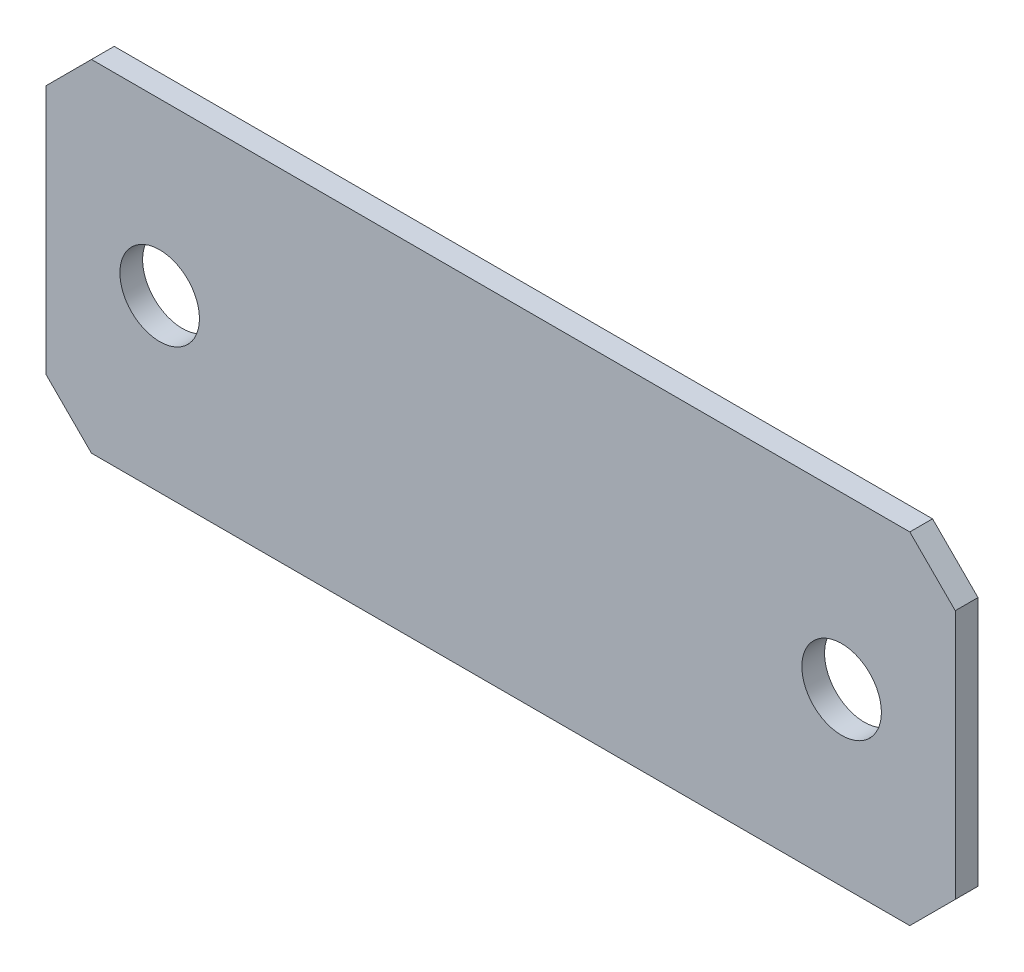
ISO-10303-21;
HEADER;
FILE_DESCRIPTION(('STEP AP214'),'2;1');
FILE_NAME('part.step','',(''),(''),'','','');
FILE_SCHEMA(('AUTOMOTIVE_DESIGN { 1 0 10303 214 1 1 1 1 }'));
ENDSEC;
DATA;
#1=APPLICATION_CONTEXT('core data for automotive mechanical design processes');
#2=APPLICATION_PROTOCOL_DEFINITION('international standard','automotive_design',2000,#1);
#3=PRODUCT_CONTEXT('',#1,'mechanical');
#4=PRODUCT('Part','Part','',(#3));
#5=PRODUCT_RELATED_PRODUCT_CATEGORY('part','',(#4));
#6=PRODUCT_DEFINITION_FORMATION('','',#4);
#7=PRODUCT_DEFINITION_CONTEXT('part definition',#1,'design');
#8=PRODUCT_DEFINITION('design','',#6,#7);
#9=PRODUCT_DEFINITION_SHAPE('','',#8);
#10=(LENGTH_UNIT() NAMED_UNIT(*) SI_UNIT(.MILLI.,.METRE.));
#11=(NAMED_UNIT(*) PLANE_ANGLE_UNIT() SI_UNIT($,.RADIAN.));
#12=(NAMED_UNIT(*) SI_UNIT($,.STERADIAN.) SOLID_ANGLE_UNIT());
#13=UNCERTAINTY_MEASURE_WITH_UNIT(LENGTH_MEASURE(1.E-05),#10,'distance_accuracy_value','');
#14=(GEOMETRIC_REPRESENTATION_CONTEXT(3) GLOBAL_UNCERTAINTY_ASSIGNED_CONTEXT((#13)) GLOBAL_UNIT_ASSIGNED_CONTEXT((#10,
#11,#12)) REPRESENTATION_CONTEXT('',''));
#15=CARTESIAN_POINT('',(0.,0.,0.));
#16=DIRECTION('',(0.,0.,1.));
#17=DIRECTION('',(1.,0.,0.));
#18=AXIS2_PLACEMENT_3D('',#15,#16,#17);
#19=CARTESIAN_POINT('',(-20.,7.5,1.));
#20=DIRECTION('',(0.,0.,1.));
#21=DIRECTION('',(1.,0.,0.));
#22=AXIS2_PLACEMENT_3D('',#19,#20,#21);
#23=PLANE('',#22);
#24=CARTESIAN_POINT('',(-15.,0.,1.));
#25=DIRECTION('',(0.,0.,1.));
#26=DIRECTION('',(1.,0.,0.));
#27=AXIS2_PLACEMENT_3D('',#24,#25,#26);
#28=CIRCLE('',#27,1.75);
#29=CARTESIAN_POINT('',(-13.25,0.,1.));
#30=VERTEX_POINT('',#29);
#31=EDGE_CURVE('E127',#30,#30,#28,.T.);
#32=ORIENTED_EDGE('',*,*,#31,.F.);
#33=EDGE_LOOP('',(#32));
#34=FACE_BOUND('',#33,.T.);
#35=DIRECTION('',(-1.,0.,0.));
#36=VECTOR('',#35,1.);
#37=CARTESIAN_POINT('',(20.,7.50000000000001,1.));
#38=LINE('',#37,#36);
#39=CARTESIAN_POINT('',(18.,7.50000000000001,1.));
#40=VERTEX_POINT('',#39);
#41=CARTESIAN_POINT('',(-18.,7.5,1.));
#42=VERTEX_POINT('',#41);
#43=EDGE_CURVE('E136',#40,#42,#38,.T.);
#44=ORIENTED_EDGE('',*,*,#43,.T.);
#45=DIRECTION('',(0.707106781186549,0.707106781186546,0.));
#46=VECTOR('',#45,1.);
#47=CARTESIAN_POINT('',(-19.,6.5,1.));
#48=LINE('',#47,#46);
#49=CARTESIAN_POINT('',(-20.,5.5,1.));
#50=VERTEX_POINT('',#49);
#51=EDGE_CURVE('E155',#42,#50,#48,.F.);
#52=ORIENTED_EDGE('',*,*,#51,.T.);
#53=DIRECTION('',(0.,-1.,0.));
#54=VECTOR('',#53,1.);
#55=CARTESIAN_POINT('',(-20.,-7.5,1.));
#56=LINE('',#55,#54);
#57=CARTESIAN_POINT('',(-20.,-5.5,1.));
#58=VERTEX_POINT('',#57);
#59=EDGE_CURVE('E119',#50,#58,#56,.T.);
#60=ORIENTED_EDGE('',*,*,#59,.T.);
#61=DIRECTION('',(-0.707106781186548,0.707106781186548,0.));
#62=VECTOR('',#61,1.);
#63=CARTESIAN_POINT('',(-26.5,1.,1.));
#64=LINE('',#63,#62);
#65=CARTESIAN_POINT('',(-18.,-7.5,1.));
#66=VERTEX_POINT('',#65);
#67=EDGE_CURVE('E153',#58,#66,#64,.F.);
#68=ORIENTED_EDGE('',*,*,#67,.T.);
#69=DIRECTION('',(1.,0.,0.));
#70=VECTOR('',#69,1.);
#71=CARTESIAN_POINT('',(20.,-7.49999999999999,1.));
#72=LINE('',#71,#70);
#73=CARTESIAN_POINT('',(18.,-7.49999999999999,1.));
#74=VERTEX_POINT('',#73);
#75=EDGE_CURVE('E166',#66,#74,#72,.T.);
#76=ORIENTED_EDGE('',*,*,#75,.T.);
#77=DIRECTION('',(-0.707106781186549,-0.707106781186546,0.));
#78=VECTOR('',#77,1.);
#79=CARTESIAN_POINT('',(6.49999999999991,-19.,1.));
#80=LINE('',#79,#78);
#81=CARTESIAN_POINT('',(20.,-5.5,1.));
#82=VERTEX_POINT('',#81);
#83=EDGE_CURVE('E54',#74,#82,#80,.F.);
#84=ORIENTED_EDGE('',*,*,#83,.T.);
#85=DIRECTION('',(0.,1.,0.));
#86=VECTOR('',#85,1.);
#87=CARTESIAN_POINT('',(20.,-7.49999999999999,1.));
#88=LINE('',#87,#86);
#89=CARTESIAN_POINT('',(20.,5.50000000000001,1.));
#90=VERTEX_POINT('',#89);
#91=EDGE_CURVE('E174',#82,#90,#88,.T.);
#92=ORIENTED_EDGE('',*,*,#91,.T.);
#93=DIRECTION('',(0.707106781186547,-0.707106781186548,0.));
#94=VECTOR('',#93,1.);
#95=CARTESIAN_POINT('',(-0.999999999999949,26.5,1.));
#96=LINE('',#95,#94);
#97=EDGE_CURVE('E150',#90,#40,#96,.F.);
#98=ORIENTED_EDGE('',*,*,#97,.T.);
#99=EDGE_LOOP('',(#44,#52,#60,#68,#76,#84,#92,#98));
#100=FACE_BOUND('',#99,.T.);
#101=CARTESIAN_POINT('',(15.,0.,1.));
#102=DIRECTION('',(0.,0.,1.));
#103=DIRECTION('',(1.,0.,0.));
#104=AXIS2_PLACEMENT_3D('',#101,#102,#103);
#105=CIRCLE('',#104,1.75);
#106=CARTESIAN_POINT('',(16.75,0.,1.));
#107=VERTEX_POINT('',#106);
#108=EDGE_CURVE('E181',#107,#107,#105,.T.);
#109=ORIENTED_EDGE('',*,*,#108,.F.);
#110=EDGE_LOOP('',(#109));
#111=FACE_BOUND('',#110,.T.);
#112=ADVANCED_FACE('F33',(#34,#100,#111),#23,.T.);
#113=CARTESIAN_POINT('',(-20.,7.5,0.));
#114=DIRECTION('',(0.,0.,1.));
#115=DIRECTION('',(1.,0.,0.));
#116=AXIS2_PLACEMENT_3D('',#113,#114,#115);
#117=PLANE('',#116);
#118=CARTESIAN_POINT('',(-15.,0.,0.));
#119=DIRECTION('',(0.,0.,1.));
#120=DIRECTION('',(1.,0.,0.));
#121=AXIS2_PLACEMENT_3D('',#118,#119,#120);
#122=CIRCLE('',#121,1.75);
#123=CARTESIAN_POINT('',(-13.25,0.,0.));
#124=VERTEX_POINT('',#123);
#125=EDGE_CURVE('E133',#124,#124,#122,.T.);
#126=ORIENTED_EDGE('',*,*,#125,.T.);
#127=EDGE_LOOP('',(#126));
#128=FACE_BOUND('',#127,.T.);
#129=DIRECTION('',(0.,-1.,0.));
#130=VECTOR('',#129,1.);
#131=CARTESIAN_POINT('',(-20.,-7.5,0.));
#132=LINE('',#131,#130);
#133=CARTESIAN_POINT('',(-20.,5.5,0.));
#134=VERTEX_POINT('',#133);
#135=CARTESIAN_POINT('',(-20.,-5.5,0.));
#136=VERTEX_POINT('',#135);
#137=EDGE_CURVE('E116',#134,#136,#132,.T.);
#138=ORIENTED_EDGE('',*,*,#137,.F.);
#139=DIRECTION('',(-0.707106781186549,-0.707106781186546,0.));
#140=VECTOR('',#139,1.);
#141=CARTESIAN_POINT('',(-20.,5.5,0.));
#142=LINE('',#141,#140);
#143=CARTESIAN_POINT('',(-18.,7.5,0.));
#144=VERTEX_POINT('',#143);
#145=EDGE_CURVE('E99',#134,#144,#142,.F.);
#146=ORIENTED_EDGE('',*,*,#145,.T.);
#147=DIRECTION('',(-1.,0.,0.));
#148=VECTOR('',#147,1.);
#149=CARTESIAN_POINT('',(20.,7.50000000000001,0.));
#150=LINE('',#149,#148);
#151=CARTESIAN_POINT('',(18.,7.50000000000001,0.));
#152=VERTEX_POINT('',#151);
#153=EDGE_CURVE('E140',#152,#144,#150,.T.);
#154=ORIENTED_EDGE('',*,*,#153,.F.);
#155=DIRECTION('',(-0.707106781186547,0.707106781186548,0.));
#156=VECTOR('',#155,1.);
#157=CARTESIAN_POINT('',(18.,7.50000000000001,0.));
#158=LINE('',#157,#156);
#159=CARTESIAN_POINT('',(20.,5.50000000000001,0.));
#160=VERTEX_POINT('',#159);
#161=EDGE_CURVE('E120',#152,#160,#158,.F.);
#162=ORIENTED_EDGE('',*,*,#161,.T.);
#163=DIRECTION('',(0.,1.,0.));
#164=VECTOR('',#163,1.);
#165=CARTESIAN_POINT('',(20.,-7.49999999999999,0.));
#166=LINE('',#165,#164);
#167=CARTESIAN_POINT('',(20.,-5.5,0.));
#168=VERTEX_POINT('',#167);
#169=EDGE_CURVE('E130',#168,#160,#166,.T.);
#170=ORIENTED_EDGE('',*,*,#169,.F.);
#171=DIRECTION('',(0.707106781186549,0.707106781186546,0.));
#172=VECTOR('',#171,1.);
#173=CARTESIAN_POINT('',(20.,-5.5,0.));
#174=LINE('',#173,#172);
#175=CARTESIAN_POINT('',(18.,-7.49999999999999,0.));
#176=VERTEX_POINT('',#175);
#177=EDGE_CURVE('E144',#168,#176,#174,.F.);
#178=ORIENTED_EDGE('',*,*,#177,.T.);
#179=DIRECTION('',(1.,0.,0.));
#180=VECTOR('',#179,1.);
#181=CARTESIAN_POINT('',(20.,-7.49999999999999,0.));
#182=LINE('',#181,#180);
#183=CARTESIAN_POINT('',(-18.,-7.5,0.));
#184=VERTEX_POINT('',#183);
#185=EDGE_CURVE('E126',#184,#176,#182,.T.);
#186=ORIENTED_EDGE('',*,*,#185,.F.);
#187=DIRECTION('',(0.707106781186548,-0.707106781186548,0.));
#188=VECTOR('',#187,1.);
#189=CARTESIAN_POINT('',(-18.,-7.5,0.));
#190=LINE('',#189,#188);
#191=EDGE_CURVE('E110',#184,#136,#190,.F.);
#192=ORIENTED_EDGE('',*,*,#191,.T.);
#193=EDGE_LOOP('',(#138,#146,#154,#162,#170,#178,#186,#192));
#194=FACE_BOUND('',#193,.T.);
#195=CARTESIAN_POINT('',(15.,0.,0.));
#196=DIRECTION('',(0.,0.,1.));
#197=DIRECTION('',(1.,0.,0.));
#198=AXIS2_PLACEMENT_3D('',#195,#196,#197);
#199=CIRCLE('',#198,1.75);
#200=CARTESIAN_POINT('',(16.75,0.,0.));
#201=VERTEX_POINT('',#200);
#202=EDGE_CURVE('E183',#201,#201,#199,.T.);
#203=ORIENTED_EDGE('',*,*,#202,.T.);
#204=EDGE_LOOP('',(#203));
#205=FACE_BOUND('',#204,.T.);
#206=ADVANCED_FACE('F123',(#128,#194,#205),#117,.F.);
#207=CARTESIAN_POINT('',(-20.,-7.5,1.));
#208=DIRECTION('',(1.,0.,0.));
#209=DIRECTION('',(0.,0.,-1.));
#210=AXIS2_PLACEMENT_3D('',#207,#208,#209);
#211=PLANE('',#210);
#212=ORIENTED_EDGE('',*,*,#59,.F.);
#213=DIRECTION('',(0.,0.,-1.));
#214=VECTOR('',#213,1.);
#215=CARTESIAN_POINT('',(-20.,5.5,1.));
#216=LINE('',#215,#214);
#217=EDGE_CURVE('E103',#50,#134,#216,.T.);
#218=ORIENTED_EDGE('',*,*,#217,.T.);
#219=ORIENTED_EDGE('',*,*,#137,.T.);
#220=DIRECTION('',(0.,0.,1.));
#221=VECTOR('',#220,1.);
#222=CARTESIAN_POINT('',(-20.,-5.5,1.));
#223=LINE('',#222,#221);
#224=EDGE_CURVE('E121',#136,#58,#223,.T.);
#225=ORIENTED_EDGE('',*,*,#224,.T.);
#226=EDGE_LOOP('',(#212,#218,#219,#225));
#227=FACE_BOUND('',#226,.T.);
#228=ADVANCED_FACE('F115',(#227),#211,.F.);
#229=CARTESIAN_POINT('',(20.,-7.49999999999999,1.));
#230=DIRECTION('',(0.,1.,0.));
#231=DIRECTION('',(-1.,0.,0.));
#232=AXIS2_PLACEMENT_3D('',#229,#230,#231);
#233=PLANE('',#232);
#234=ORIENTED_EDGE('',*,*,#75,.F.);
#235=DIRECTION('',(0.,0.,-1.));
#236=VECTOR('',#235,1.);
#237=CARTESIAN_POINT('',(-18.,-7.5,1.));
#238=LINE('',#237,#236);
#239=EDGE_CURVE('E159',#66,#184,#238,.T.);
#240=ORIENTED_EDGE('',*,*,#239,.T.);
#241=ORIENTED_EDGE('',*,*,#185,.T.);
#242=DIRECTION('',(0.,0.,1.));
#243=VECTOR('',#242,1.);
#244=CARTESIAN_POINT('',(18.,-7.49999999999999,1.));
#245=LINE('',#244,#243);
#246=EDGE_CURVE('E157',#176,#74,#245,.T.);
#247=ORIENTED_EDGE('',*,*,#246,.T.);
#248=EDGE_LOOP('',(#234,#240,#241,#247));
#249=FACE_BOUND('',#248,.T.);
#250=ADVANCED_FACE('F164',(#249),#233,.F.);
#251=CARTESIAN_POINT('',(20.,-7.49999999999999,1.));
#252=DIRECTION('',(-1.,0.,0.));
#253=DIRECTION('',(0.,0.,1.));
#254=AXIS2_PLACEMENT_3D('',#251,#252,#253);
#255=PLANE('',#254);
#256=ORIENTED_EDGE('',*,*,#91,.F.);
#257=DIRECTION('',(0.,0.,-1.));
#258=VECTOR('',#257,1.);
#259=CARTESIAN_POINT('',(20.,-5.5,1.));
#260=LINE('',#259,#258);
#261=EDGE_CURVE('E11',#82,#168,#260,.T.);
#262=ORIENTED_EDGE('',*,*,#261,.T.);
#263=ORIENTED_EDGE('',*,*,#169,.T.);
#264=DIRECTION('',(0.,0.,1.));
#265=VECTOR('',#264,1.);
#266=CARTESIAN_POINT('',(20.,5.50000000000001,1.));
#267=LINE('',#266,#265);
#268=EDGE_CURVE('E41',#160,#90,#267,.T.);
#269=ORIENTED_EDGE('',*,*,#268,.T.);
#270=EDGE_LOOP('',(#256,#262,#263,#269));
#271=FACE_BOUND('',#270,.T.);
#272=ADVANCED_FACE('F173',(#271),#255,.F.);
#273=CARTESIAN_POINT('',(20.,7.50000000000001,1.));
#274=DIRECTION('',(0.,-1.,0.));
#275=DIRECTION('',(1.,0.,0.));
#276=AXIS2_PLACEMENT_3D('',#273,#274,#275);
#277=PLANE('',#276);
#278=ORIENTED_EDGE('',*,*,#153,.T.);
#279=DIRECTION('',(0.,0.,1.));
#280=VECTOR('',#279,1.);
#281=CARTESIAN_POINT('',(-18.,7.5,1.));
#282=LINE('',#281,#280);
#283=EDGE_CURVE('E104',#144,#42,#282,.T.);
#284=ORIENTED_EDGE('',*,*,#283,.T.);
#285=ORIENTED_EDGE('',*,*,#43,.F.);
#286=DIRECTION('',(0.,0.,-1.));
#287=VECTOR('',#286,1.);
#288=CARTESIAN_POINT('',(18.,7.50000000000001,1.));
#289=LINE('',#288,#287);
#290=EDGE_CURVE('E109',#40,#152,#289,.T.);
#291=ORIENTED_EDGE('',*,*,#290,.T.);
#292=EDGE_LOOP('',(#278,#284,#285,#291));
#293=FACE_BOUND('',#292,.T.);
#294=ADVANCED_FACE('F205',(#293),#277,.F.);
#295=CARTESIAN_POINT('',(-15.,0.,1.));
#296=DIRECTION('',(0.,0.,-1.));
#297=DIRECTION('',(-1.,0.,0.));
#298=AXIS2_PLACEMENT_3D('',#295,#296,#297);
#299=CYLINDRICAL_SURFACE('',#298,1.75);
#300=ORIENTED_EDGE('',*,*,#31,.T.);
#301=EDGE_LOOP('',(#300));
#302=FACE_BOUND('',#301,.T.);
#303=ORIENTED_EDGE('',*,*,#125,.F.);
#304=EDGE_LOOP('',(#303));
#305=FACE_BOUND('',#304,.T.);
#306=ADVANCED_FACE('F202',(#302,#305),#299,.F.);
#307=CARTESIAN_POINT('',(15.,0.,1.));
#308=DIRECTION('',(0.,0.,-1.));
#309=DIRECTION('',(-1.,0.,0.));
#310=AXIS2_PLACEMENT_3D('',#307,#308,#309);
#311=CYLINDRICAL_SURFACE('',#310,1.75);
#312=ORIENTED_EDGE('',*,*,#108,.T.);
#313=EDGE_LOOP('',(#312));
#314=FACE_BOUND('',#313,.T.);
#315=ORIENTED_EDGE('',*,*,#202,.F.);
#316=EDGE_LOOP('',(#315));
#317=FACE_BOUND('',#316,.T.);
#318=ADVANCED_FACE('F189',(#314,#317),#311,.F.);
#319=CARTESIAN_POINT('',(-20.,5.5,1.));
#320=DIRECTION('',(0.707106781186546,-0.707106781186549,0.));
#321=DIRECTION('',(0.707106781186549,0.707106781186546,0.));
#322=AXIS2_PLACEMENT_3D('',#319,#320,#321);
#323=PLANE('',#322);
#324=ORIENTED_EDGE('',*,*,#51,.F.);
#325=ORIENTED_EDGE('',*,*,#283,.F.);
#326=ORIENTED_EDGE('',*,*,#145,.F.);
#327=ORIENTED_EDGE('',*,*,#217,.F.);
#328=EDGE_LOOP('',(#324,#325,#326,#327));
#329=FACE_BOUND('',#328,.T.);
#330=ADVANCED_FACE('F102',(#329),#323,.F.);
#331=CARTESIAN_POINT('',(-18.,-7.5,1.));
#332=DIRECTION('',(0.707106781186547,0.707106781186547,0.));
#333=DIRECTION('',(-0.707106781186548,0.707106781186548,0.));
#334=AXIS2_PLACEMENT_3D('',#331,#332,#333);
#335=PLANE('',#334);
#336=ORIENTED_EDGE('',*,*,#67,.F.);
#337=ORIENTED_EDGE('',*,*,#224,.F.);
#338=ORIENTED_EDGE('',*,*,#191,.F.);
#339=ORIENTED_EDGE('',*,*,#239,.F.);
#340=EDGE_LOOP('',(#336,#337,#338,#339));
#341=FACE_BOUND('',#340,.T.);
#342=ADVANCED_FACE('F217',(#341),#335,.F.);
#343=CARTESIAN_POINT('',(20.,-5.5,1.));
#344=DIRECTION('',(-0.707106781186546,0.707106781186549,0.));
#345=DIRECTION('',(-0.707106781186549,-0.707106781186546,0.));
#346=AXIS2_PLACEMENT_3D('',#343,#344,#345);
#347=PLANE('',#346);
#348=ORIENTED_EDGE('',*,*,#83,.F.);
#349=ORIENTED_EDGE('',*,*,#246,.F.);
#350=ORIENTED_EDGE('',*,*,#177,.F.);
#351=ORIENTED_EDGE('',*,*,#261,.F.);
#352=EDGE_LOOP('',(#348,#349,#350,#351));
#353=FACE_BOUND('',#352,.T.);
#354=ADVANCED_FACE('F172',(#353),#347,.F.);
#355=CARTESIAN_POINT('',(18.,7.50000000000001,1.));
#356=DIRECTION('',(-0.707106781186548,-0.707106781186547,0.));
#357=DIRECTION('',(0.707106781186547,-0.707106781186548,0.));
#358=AXIS2_PLACEMENT_3D('',#355,#356,#357);
#359=PLANE('',#358);
#360=ORIENTED_EDGE('',*,*,#97,.F.);
#361=ORIENTED_EDGE('',*,*,#268,.F.);
#362=ORIENTED_EDGE('',*,*,#161,.F.);
#363=ORIENTED_EDGE('',*,*,#290,.F.);
#364=EDGE_LOOP('',(#360,#361,#362,#363));
#365=FACE_BOUND('',#364,.T.);
#366=ADVANCED_FACE('F35',(#365),#359,.F.);
#367=CLOSED_SHELL('',(#112,#206,#228,#250,#272,#294,#306,#318,#330,#342,#354,#366));
#368=MANIFOLD_SOLID_BREP('B2',#367);
#369=ADVANCED_BREP_SHAPE_REPRESENTATION('',(#18,#368),#14);
#370=SHAPE_DEFINITION_REPRESENTATION(#9,#369);
ENDSEC;
END-ISO-10303-21;
